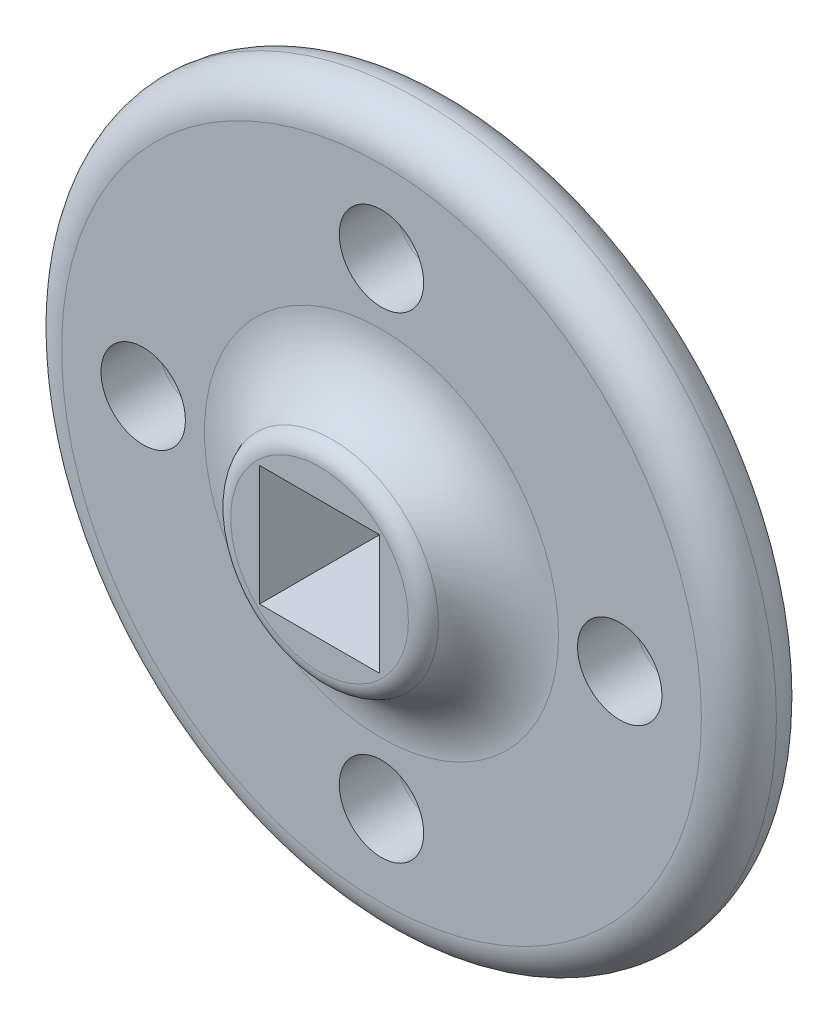
ISO-10303-21;
HEADER;
FILE_DESCRIPTION(('STEP AP214'),'2;1');
FILE_NAME('part.step','',(''),(''),'','','');
FILE_SCHEMA(('AUTOMOTIVE_DESIGN { 1 0 10303 214 1 1 1 1 }'));
ENDSEC;
DATA;
#1=APPLICATION_CONTEXT('core data for automotive mechanical design processes');
#2=APPLICATION_PROTOCOL_DEFINITION('international standard','automotive_design',2000,#1);
#3=PRODUCT_CONTEXT('',#1,'mechanical');
#4=PRODUCT('Part','Part','',(#3));
#5=PRODUCT_RELATED_PRODUCT_CATEGORY('part','',(#4));
#6=PRODUCT_DEFINITION_FORMATION('','',#4);
#7=PRODUCT_DEFINITION_CONTEXT('part definition',#1,'design');
#8=PRODUCT_DEFINITION('design','',#6,#7);
#9=PRODUCT_DEFINITION_SHAPE('','',#8);
#10=(LENGTH_UNIT() NAMED_UNIT(*) SI_UNIT(.MILLI.,.METRE.));
#11=(NAMED_UNIT(*) PLANE_ANGLE_UNIT() SI_UNIT($,.RADIAN.));
#12=(NAMED_UNIT(*) SI_UNIT($,.STERADIAN.) SOLID_ANGLE_UNIT());
#13=UNCERTAINTY_MEASURE_WITH_UNIT(LENGTH_MEASURE(1.E-05),#10,'distance_accuracy_value','');
#14=(GEOMETRIC_REPRESENTATION_CONTEXT(3) GLOBAL_UNCERTAINTY_ASSIGNED_CONTEXT((#13)) GLOBAL_UNIT_ASSIGNED_CONTEXT((#10,
#11,#12)) REPRESENTATION_CONTEXT('',''));
#15=CARTESIAN_POINT('',(0.,0.,0.));
#16=DIRECTION('',(0.,0.,1.));
#17=DIRECTION('',(1.,0.,0.));
#18=AXIS2_PLACEMENT_3D('',#15,#16,#17);
#19=CARTESIAN_POINT('',(0.,0.,4.));
#20=DIRECTION('',(0.,0.,1.));
#21=DIRECTION('',(1.,0.,0.));
#22=AXIS2_PLACEMENT_3D('',#19,#20,#21);
#23=PLANE('',#22);
#24=CARTESIAN_POINT('',(0.,0.,4.));
#25=DIRECTION('',(0.,0.,1.));
#26=DIRECTION('',(1.,0.,0.));
#27=AXIS2_PLACEMENT_3D('',#24,#25,#26);
#28=CIRCLE('',#27,17.05);
#29=CARTESIAN_POINT('',(17.05,0.,4.));
#30=VERTEX_POINT('',#29);
#31=EDGE_CURVE('E165',#30,#30,#28,.T.);
#32=ORIENTED_EDGE('',*,*,#31,.T.);
#33=EDGE_LOOP('',(#32));
#34=FACE_BOUND('',#33,.T.);
#35=CARTESIAN_POINT('',(0.,0.,4.));
#36=DIRECTION('',(0.,0.,1.));
#37=DIRECTION('',(1.,0.,0.));
#38=AXIS2_PLACEMENT_3D('',#35,#36,#37);
#39=CIRCLE('',#38,9.43827373350304);
#40=CARTESIAN_POINT('',(9.43827373350304,0.,4.));
#41=VERTEX_POINT('',#40);
#42=EDGE_CURVE('E153',#41,#41,#39,.F.);
#43=ORIENTED_EDGE('',*,*,#42,.T.);
#44=EDGE_LOOP('',(#43));
#45=FACE_BOUND('',#44,.T.);
#46=CARTESIAN_POINT('',(0.,12.7,4.));
#47=DIRECTION('',(0.,0.,1.));
#48=DIRECTION('',(1.,0.,0.));
#49=AXIS2_PLACEMENT_3D('',#46,#47,#48);
#50=CIRCLE('',#49,2.25);
#51=CARTESIAN_POINT('',(2.25,12.7,4.));
#52=VERTEX_POINT('',#51);
#53=EDGE_CURVE('E146',#52,#52,#50,.T.);
#54=ORIENTED_EDGE('',*,*,#53,.F.);
#55=EDGE_LOOP('',(#54));
#56=FACE_BOUND('',#55,.T.);
#57=CARTESIAN_POINT('',(-12.7,0.,4.));
#58=DIRECTION('',(0.,0.,1.));
#59=DIRECTION('',(1.,0.,0.));
#60=AXIS2_PLACEMENT_3D('',#57,#58,#59);
#61=CIRCLE('',#60,2.25);
#62=CARTESIAN_POINT('',(-10.45,0.,4.));
#63=VERTEX_POINT('',#62);
#64=EDGE_CURVE('E143',#63,#63,#61,.T.);
#65=ORIENTED_EDGE('',*,*,#64,.F.);
#66=EDGE_LOOP('',(#65));
#67=FACE_BOUND('',#66,.T.);
#68=CARTESIAN_POINT('',(0.,-12.7,4.));
#69=DIRECTION('',(0.,0.,1.));
#70=DIRECTION('',(1.,0.,0.));
#71=AXIS2_PLACEMENT_3D('',#68,#69,#70);
#72=CIRCLE('',#71,2.25);
#73=CARTESIAN_POINT('',(2.25,-12.7,4.));
#74=VERTEX_POINT('',#73);
#75=EDGE_CURVE('E140',#74,#74,#72,.T.);
#76=ORIENTED_EDGE('',*,*,#75,.F.);
#77=EDGE_LOOP('',(#76));
#78=FACE_BOUND('',#77,.T.);
#79=CARTESIAN_POINT('',(12.7,0.,4.));
#80=DIRECTION('',(0.,0.,1.));
#81=DIRECTION('',(1.,0.,0.));
#82=AXIS2_PLACEMENT_3D('',#79,#80,#81);
#83=CIRCLE('',#82,2.25);
#84=CARTESIAN_POINT('',(14.95,0.,4.));
#85=VERTEX_POINT('',#84);
#86=EDGE_CURVE('E137',#85,#85,#83,.T.);
#87=ORIENTED_EDGE('',*,*,#86,.F.);
#88=EDGE_LOOP('',(#87));
#89=FACE_BOUND('',#88,.T.);
#90=ADVANCED_FACE('F53',(#34,#45,#56,#67,#78,#89),#23,.T.);
#91=CARTESIAN_POINT('',(-3.2,0.,4.));
#92=DIRECTION('',(1.,0.,0.));
#93=DIRECTION('',(0.,1.,0.));
#94=AXIS2_PLACEMENT_3D('',#91,#92,#93);
#95=PLANE('',#94);
#96=DIRECTION('',(0.,0.,-1.));
#97=VECTOR('',#96,1.);
#98=CARTESIAN_POINT('',(-3.2,-3.2,4.));
#99=LINE('',#98,#97);
#100=CARTESIAN_POINT('',(-3.2,-3.2,7.3));
#101=VERTEX_POINT('',#100);
#102=CARTESIAN_POINT('',(-3.2,-3.2,1.));
#103=VERTEX_POINT('',#102);
#104=EDGE_CURVE('E119',#101,#103,#99,.T.);
#105=ORIENTED_EDGE('',*,*,#104,.T.);
#106=DIRECTION('',(0.,-1.,0.));
#107=VECTOR('',#106,1.);
#108=CARTESIAN_POINT('',(-3.2,3.2,1.));
#109=LINE('',#108,#107);
#110=CARTESIAN_POINT('',(-3.2,3.2,1.));
#111=VERTEX_POINT('',#110);
#112=EDGE_CURVE('E77',#103,#111,#109,.F.);
#113=ORIENTED_EDGE('',*,*,#112,.T.);
#114=DIRECTION('',(0.,0.,-1.));
#115=VECTOR('',#114,1.);
#116=CARTESIAN_POINT('',(-3.2,3.2,4.));
#117=LINE('',#116,#115);
#118=CARTESIAN_POINT('',(-3.2,3.2,7.3));
#119=VERTEX_POINT('',#118);
#120=EDGE_CURVE('E151',#119,#111,#117,.T.);
#121=ORIENTED_EDGE('',*,*,#120,.F.);
#122=DIRECTION('',(0.,1.,0.));
#123=VECTOR('',#122,1.);
#124=CARTESIAN_POINT('',(-3.2,0.,7.3));
#125=LINE('',#124,#123);
#126=EDGE_CURVE('E133',#101,#119,#125,.T.);
#127=ORIENTED_EDGE('',*,*,#126,.F.);
#128=EDGE_LOOP('',(#105,#113,#121,#127));
#129=FACE_BOUND('',#128,.T.);
#130=ADVANCED_FACE('F240',(#129),#95,.T.);
#131=CARTESIAN_POINT('',(0.,3.2,4.));
#132=DIRECTION('',(0.,-1.,0.));
#133=DIRECTION('',(1.,0.,0.));
#134=AXIS2_PLACEMENT_3D('',#131,#132,#133);
#135=PLANE('',#134);
#136=ORIENTED_EDGE('',*,*,#120,.T.);
#137=DIRECTION('',(-1.,0.,0.));
#138=VECTOR('',#137,1.);
#139=CARTESIAN_POINT('',(3.2,3.2,1.));
#140=LINE('',#139,#138);
#141=CARTESIAN_POINT('',(3.2,3.2,1.));
#142=VERTEX_POINT('',#141);
#143=EDGE_CURVE('E198',#111,#142,#140,.F.);
#144=ORIENTED_EDGE('',*,*,#143,.T.);
#145=DIRECTION('',(0.,0.,-1.));
#146=VECTOR('',#145,1.);
#147=CARTESIAN_POINT('',(3.2,3.2,4.));
#148=LINE('',#147,#146);
#149=CARTESIAN_POINT('',(3.2,3.2,7.3));
#150=VERTEX_POINT('',#149);
#151=EDGE_CURVE('E118',#150,#142,#148,.T.);
#152=ORIENTED_EDGE('',*,*,#151,.F.);
#153=DIRECTION('',(1.,0.,0.));
#154=VECTOR('',#153,1.);
#155=CARTESIAN_POINT('',(0.,3.2,7.3));
#156=LINE('',#155,#154);
#157=EDGE_CURVE('E131',#119,#150,#156,.T.);
#158=ORIENTED_EDGE('',*,*,#157,.F.);
#159=EDGE_LOOP('',(#136,#144,#152,#158));
#160=FACE_BOUND('',#159,.T.);
#161=ADVANCED_FACE('F246',(#160),#135,.T.);
#162=CARTESIAN_POINT('',(3.2,0.,4.));
#163=DIRECTION('',(1.,0.,0.));
#164=DIRECTION('',(0.,1.,0.));
#165=AXIS2_PLACEMENT_3D('',#162,#163,#164);
#166=PLANE('',#165);
#167=ORIENTED_EDGE('',*,*,#151,.T.);
#168=DIRECTION('',(0.,-1.,0.));
#169=VECTOR('',#168,1.);
#170=CARTESIAN_POINT('',(3.2,0.,1.));
#171=LINE('',#170,#169);
#172=CARTESIAN_POINT('',(3.2,-3.2,1.));
#173=VERTEX_POINT('',#172);
#174=EDGE_CURVE('E117',#142,#173,#171,.T.);
#175=ORIENTED_EDGE('',*,*,#174,.T.);
#176=DIRECTION('',(0.,0.,-1.));
#177=VECTOR('',#176,1.);
#178=CARTESIAN_POINT('',(3.2,-3.2,4.));
#179=LINE('',#178,#177);
#180=CARTESIAN_POINT('',(3.2,-3.2,7.3));
#181=VERTEX_POINT('',#180);
#182=EDGE_CURVE('E109',#181,#173,#179,.T.);
#183=ORIENTED_EDGE('',*,*,#182,.F.);
#184=DIRECTION('',(0.,1.,0.));
#185=VECTOR('',#184,1.);
#186=CARTESIAN_POINT('',(3.2,0.,7.3));
#187=LINE('',#186,#185);
#188=EDGE_CURVE('E114',#181,#150,#187,.T.);
#189=ORIENTED_EDGE('',*,*,#188,.T.);
#190=EDGE_LOOP('',(#167,#175,#183,#189));
#191=FACE_BOUND('',#190,.T.);
#192=ADVANCED_FACE('F112',(#191),#166,.F.);
#193=CARTESIAN_POINT('',(0.,12.7,4.));
#194=DIRECTION('',(0.,0.,-1.));
#195=DIRECTION('',(-1.,0.,0.));
#196=AXIS2_PLACEMENT_3D('',#193,#194,#195);
#197=CYLINDRICAL_SURFACE('',#196,2.25);
#198=CARTESIAN_POINT('',(0.,12.7,1.));
#199=DIRECTION('',(0.,0.,1.));
#200=DIRECTION('',(1.,0.,0.));
#201=AXIS2_PLACEMENT_3D('',#198,#199,#200);
#202=CIRCLE('',#201,2.25);
#203=CARTESIAN_POINT('',(2.25,12.7,1.));
#204=VERTEX_POINT('',#203);
#205=EDGE_CURVE('E12',#204,#204,#202,.F.);
#206=ORIENTED_EDGE('',*,*,#205,.T.);
#207=EDGE_LOOP('',(#206));
#208=FACE_BOUND('',#207,.T.);
#209=ORIENTED_EDGE('',*,*,#53,.T.);
#210=EDGE_LOOP('',(#209));
#211=FACE_BOUND('',#210,.T.);
#212=ADVANCED_FACE('F259',(#208,#211),#197,.F.);
#213=CARTESIAN_POINT('',(-12.7,0.,4.));
#214=DIRECTION('',(0.,0.,-1.));
#215=DIRECTION('',(-1.,0.,0.));
#216=AXIS2_PLACEMENT_3D('',#213,#214,#215);
#217=CYLINDRICAL_SURFACE('',#216,2.25);
#218=CARTESIAN_POINT('',(-12.7,0.,1.));
#219=DIRECTION('',(0.,0.,1.));
#220=DIRECTION('',(1.,0.,0.));
#221=AXIS2_PLACEMENT_3D('',#218,#219,#220);
#222=CIRCLE('',#221,2.25);
#223=CARTESIAN_POINT('',(-10.45,0.,1.));
#224=VERTEX_POINT('',#223);
#225=EDGE_CURVE('E194',#224,#224,#222,.F.);
#226=ORIENTED_EDGE('',*,*,#225,.T.);
#227=EDGE_LOOP('',(#226));
#228=FACE_BOUND('',#227,.T.);
#229=ORIENTED_EDGE('',*,*,#64,.T.);
#230=EDGE_LOOP('',(#229));
#231=FACE_BOUND('',#230,.T.);
#232=ADVANCED_FACE('F265',(#228,#231),#217,.F.);
#233=CARTESIAN_POINT('',(0.,-12.7,4.));
#234=DIRECTION('',(0.,0.,-1.));
#235=DIRECTION('',(-1.,0.,0.));
#236=AXIS2_PLACEMENT_3D('',#233,#234,#235);
#237=CYLINDRICAL_SURFACE('',#236,2.25);
#238=CARTESIAN_POINT('',(0.,-12.7,1.));
#239=DIRECTION('',(0.,0.,1.));
#240=DIRECTION('',(1.,0.,0.));
#241=AXIS2_PLACEMENT_3D('',#238,#239,#240);
#242=CIRCLE('',#241,2.25);
#243=CARTESIAN_POINT('',(2.25,-12.7,1.));
#244=VERTEX_POINT('',#243);
#245=EDGE_CURVE('E191',#244,#244,#242,.F.);
#246=ORIENTED_EDGE('',*,*,#245,.T.);
#247=EDGE_LOOP('',(#246));
#248=FACE_BOUND('',#247,.T.);
#249=ORIENTED_EDGE('',*,*,#75,.T.);
#250=EDGE_LOOP('',(#249));
#251=FACE_BOUND('',#250,.T.);
#252=ADVANCED_FACE('F269',(#248,#251),#237,.F.);
#253=CARTESIAN_POINT('',(12.7,0.,4.));
#254=DIRECTION('',(0.,0.,-1.));
#255=DIRECTION('',(-1.,0.,0.));
#256=AXIS2_PLACEMENT_3D('',#253,#254,#255);
#257=CYLINDRICAL_SURFACE('',#256,2.25);
#258=CARTESIAN_POINT('',(12.7,0.,1.));
#259=DIRECTION('',(0.,0.,1.));
#260=DIRECTION('',(1.,0.,0.));
#261=AXIS2_PLACEMENT_3D('',#258,#259,#260);
#262=CIRCLE('',#261,2.25);
#263=CARTESIAN_POINT('',(14.95,0.,1.));
#264=VERTEX_POINT('',#263);
#265=EDGE_CURVE('E62',#264,#264,#262,.F.);
#266=ORIENTED_EDGE('',*,*,#265,.T.);
#267=EDGE_LOOP('',(#266));
#268=FACE_BOUND('',#267,.T.);
#269=ORIENTED_EDGE('',*,*,#86,.T.);
#270=EDGE_LOOP('',(#269));
#271=FACE_BOUND('',#270,.T.);
#272=ADVANCED_FACE('F256',(#268,#271),#257,.F.);
#273=CARTESIAN_POINT('',(0.,-3.2,4.));
#274=DIRECTION('',(0.,-1.,0.));
#275=DIRECTION('',(1.,0.,0.));
#276=AXIS2_PLACEMENT_3D('',#273,#274,#275);
#277=PLANE('',#276);
#278=ORIENTED_EDGE('',*,*,#182,.T.);
#279=DIRECTION('',(-1.,0.,0.));
#280=VECTOR('',#279,1.);
#281=CARTESIAN_POINT('',(0.,-3.2,1.));
#282=LINE('',#281,#280);
#283=EDGE_CURVE('E70',#173,#103,#282,.T.);
#284=ORIENTED_EDGE('',*,*,#283,.T.);
#285=ORIENTED_EDGE('',*,*,#104,.F.);
#286=DIRECTION('',(1.,0.,0.));
#287=VECTOR('',#286,1.);
#288=CARTESIAN_POINT('',(0.,-3.2,7.3));
#289=LINE('',#288,#287);
#290=EDGE_CURVE('E122',#101,#181,#289,.T.);
#291=ORIENTED_EDGE('',*,*,#290,.T.);
#292=EDGE_LOOP('',(#278,#284,#285,#291));
#293=FACE_BOUND('',#292,.T.);
#294=ADVANCED_FACE('F123',(#293),#277,.F.);
#295=CARTESIAN_POINT('',(0.,0.,0.));
#296=DIRECTION('',(0.,0.,1.));
#297=DIRECTION('',(1.,0.,0.));
#298=AXIS2_PLACEMENT_3D('',#295,#296,#297);
#299=PLANE('',#298);
#300=CARTESIAN_POINT('',(0.,-12.7,0.));
#301=DIRECTION('',(0.,0.,1.));
#302=DIRECTION('',(1.,0.,0.));
#303=AXIS2_PLACEMENT_3D('',#300,#301,#302);
#304=CIRCLE('',#303,3.25);
#305=CARTESIAN_POINT('',(3.25,-12.7,0.));
#306=VERTEX_POINT('',#305);
#307=EDGE_CURVE('E188',#306,#306,#304,.T.);
#308=ORIENTED_EDGE('',*,*,#307,.T.);
#309=EDGE_LOOP('',(#308));
#310=FACE_BOUND('',#309,.T.);
#311=CARTESIAN_POINT('',(-12.7,0.,0.));
#312=DIRECTION('',(0.,0.,1.));
#313=DIRECTION('',(1.,0.,0.));
#314=AXIS2_PLACEMENT_3D('',#311,#312,#313);
#315=CIRCLE('',#314,3.25);
#316=CARTESIAN_POINT('',(-9.45,0.,0.));
#317=VERTEX_POINT('',#316);
#318=EDGE_CURVE('E185',#317,#317,#315,.T.);
#319=ORIENTED_EDGE('',*,*,#318,.T.);
#320=EDGE_LOOP('',(#319));
#321=FACE_BOUND('',#320,.T.);
#322=DIRECTION('',(-1.,0.,0.));
#323=VECTOR('',#322,1.);
#324=CARTESIAN_POINT('',(0.,-4.2,0.));
#325=LINE('',#324,#323);
#326=CARTESIAN_POINT('',(-4.2,-4.2,0.));
#327=VERTEX_POINT('',#326);
#328=CARTESIAN_POINT('',(4.2,-4.2,0.));
#329=VERTEX_POINT('',#328);
#330=EDGE_CURVE('E176',#327,#329,#325,.F.);
#331=ORIENTED_EDGE('',*,*,#330,.T.);
#332=DIRECTION('',(0.,-1.,0.));
#333=VECTOR('',#332,1.);
#334=CARTESIAN_POINT('',(4.2,0.,0.));
#335=LINE('',#334,#333);
#336=CARTESIAN_POINT('',(4.2,4.2,0.));
#337=VERTEX_POINT('',#336);
#338=EDGE_CURVE('E182',#329,#337,#335,.F.);
#339=ORIENTED_EDGE('',*,*,#338,.T.);
#340=DIRECTION('',(-1.,0.,0.));
#341=VECTOR('',#340,1.);
#342=CARTESIAN_POINT('',(-3.2,4.2,0.));
#343=LINE('',#342,#341);
#344=CARTESIAN_POINT('',(-4.2,4.2,0.));
#345=VERTEX_POINT('',#344);
#346=EDGE_CURVE('E180',#337,#345,#343,.T.);
#347=ORIENTED_EDGE('',*,*,#346,.T.);
#348=DIRECTION('',(0.,-1.,0.));
#349=VECTOR('',#348,1.);
#350=CARTESIAN_POINT('',(-4.2,-3.2,0.));
#351=LINE('',#350,#349);
#352=EDGE_CURVE('E178',#345,#327,#351,.T.);
#353=ORIENTED_EDGE('',*,*,#352,.T.);
#354=EDGE_LOOP('',(#331,#339,#347,#353));
#355=FACE_BOUND('',#354,.T.);
#356=CARTESIAN_POINT('',(12.7,0.,0.));
#357=DIRECTION('',(0.,0.,1.));
#358=DIRECTION('',(1.,0.,0.));
#359=AXIS2_PLACEMENT_3D('',#356,#357,#358);
#360=CIRCLE('',#359,3.25);
#361=CARTESIAN_POINT('',(15.95,0.,0.));
#362=VERTEX_POINT('',#361);
#363=EDGE_CURVE('E173',#362,#362,#360,.T.);
#364=ORIENTED_EDGE('',*,*,#363,.T.);
#365=EDGE_LOOP('',(#364));
#366=FACE_BOUND('',#365,.T.);
#367=CARTESIAN_POINT('',(0.,12.7,0.));
#368=DIRECTION('',(0.,0.,1.));
#369=DIRECTION('',(1.,0.,0.));
#370=AXIS2_PLACEMENT_3D('',#367,#368,#369);
#371=CIRCLE('',#370,3.25);
#372=CARTESIAN_POINT('',(3.25,12.7,0.));
#373=VERTEX_POINT('',#372);
#374=EDGE_CURVE('E168',#373,#373,#371,.T.);
#375=ORIENTED_EDGE('',*,*,#374,.T.);
#376=EDGE_LOOP('',(#375));
#377=FACE_BOUND('',#376,.T.);
#378=CARTESIAN_POINT('',(0.,0.,0.));
#379=DIRECTION('',(0.,0.,1.));
#380=DIRECTION('',(1.,0.,0.));
#381=AXIS2_PLACEMENT_3D('',#378,#379,#380);
#382=CIRCLE('',#381,17.05);
#383=CARTESIAN_POINT('',(17.05,0.,0.));
#384=VERTEX_POINT('',#383);
#385=EDGE_CURVE('E162',#384,#384,#382,.F.);
#386=ORIENTED_EDGE('',*,*,#385,.T.);
#387=EDGE_LOOP('',(#386));
#388=FACE_BOUND('',#387,.T.);
#389=ADVANCED_FACE('F223',(#310,#321,#355,#366,#377,#388),#299,.F.);
#390=CARTESIAN_POINT('',(0.,0.,7.3));
#391=DIRECTION('',(0.,0.,1.));
#392=DIRECTION('',(1.,0.,0.));
#393=AXIS2_PLACEMENT_3D('',#390,#391,#392);
#394=PLANE('',#393);
#395=CARTESIAN_POINT('',(0.,0.,7.3));
#396=DIRECTION('',(0.,0.,1.));
#397=DIRECTION('',(1.,0.,0.));
#398=AXIS2_PLACEMENT_3D('',#395,#396,#397);
#399=CIRCLE('',#398,4.73614655529954);
#400=CARTESIAN_POINT('',(4.73614655529954,0.,7.3));
#401=VERTEX_POINT('',#400);
#402=EDGE_CURVE('E156',#401,#401,#399,.T.);
#403=ORIENTED_EDGE('',*,*,#402,.T.);
#404=EDGE_LOOP('',(#403));
#405=FACE_BOUND('',#404,.T.);
#406=ORIENTED_EDGE('',*,*,#188,.F.);
#407=ORIENTED_EDGE('',*,*,#290,.F.);
#408=ORIENTED_EDGE('',*,*,#126,.T.);
#409=ORIENTED_EDGE('',*,*,#157,.T.);
#410=EDGE_LOOP('',(#406,#407,#408,#409));
#411=FACE_BOUND('',#410,.T.);
#412=ADVANCED_FACE('F129',(#405,#411),#394,.T.);
#413=CARTESIAN_POINT('',(0.,0.,8.));
#414=DIRECTION('',(0.,0.,1.));
#415=DIRECTION('',(1.,0.,0.));
#416=AXIS2_PLACEMENT_3D('',#413,#414,#415);
#417=TOROIDAL_SURFACE('',#416,9.43827373350304,4.);
#418=CARTESIAN_POINT('',(0.,0.,6.64));
#419=DIRECTION('',(0.,0.,1.));
#420=DIRECTION('',(1.,0.,0.));
#421=AXIS2_PLACEMENT_3D('',#418,#419,#420);
#422=CIRCLE('',#421,5.67657199094024);
#423=CARTESIAN_POINT('',(5.67657199094024,0.,6.64));
#424=VERTEX_POINT('',#423);
#425=EDGE_CURVE('E159',#424,#424,#422,.F.);
#426=ORIENTED_EDGE('',*,*,#425,.T.);
#427=EDGE_LOOP('',(#426));
#428=FACE_BOUND('',#427,.T.);
#429=ORIENTED_EDGE('',*,*,#42,.F.);
#430=EDGE_LOOP('',(#429));
#431=FACE_BOUND('',#430,.T.);
#432=ADVANCED_FACE('F277',(#428,#431),#417,.F.);
#433=CARTESIAN_POINT('',(0.,0.,6.3));
#434=DIRECTION('',(0.,0.,-1.));
#435=DIRECTION('',(-1.,0.,0.));
#436=AXIS2_PLACEMENT_3D('',#433,#434,#435);
#437=TOROIDAL_SURFACE('',#436,4.73614655529954,1.);
#438=ORIENTED_EDGE('',*,*,#425,.F.);
#439=EDGE_LOOP('',(#438));
#440=FACE_BOUND('',#439,.T.);
#441=ORIENTED_EDGE('',*,*,#402,.F.);
#442=EDGE_LOOP('',(#441));
#443=FACE_BOUND('',#442,.T.);
#444=ADVANCED_FACE('F280',(#440,#443),#437,.T.);
#445=CARTESIAN_POINT('',(0.,0.,2.));
#446=DIRECTION('',(0.,0.,1.));
#447=DIRECTION('',(1.,0.,0.));
#448=AXIS2_PLACEMENT_3D('',#445,#446,#447);
#449=TOROIDAL_SURFACE('',#448,17.05,2.);
#450=ORIENTED_EDGE('',*,*,#31,.F.);
#451=EDGE_LOOP('',(#450));
#452=FACE_BOUND('',#451,.T.);
#453=CARTESIAN_POINT('',(0.,0.,2.));
#454=DIRECTION('',(0.,0.,1.));
#455=DIRECTION('',(1.,0.,0.));
#456=AXIS2_PLACEMENT_3D('',#453,#454,#455);
#457=CIRCLE('',#456,19.05);
#458=CARTESIAN_POINT('',(19.05,0.,2.));
#459=VERTEX_POINT('',#458);
#460=EDGE_CURVE('E127',#459,#459,#457,.F.);
#461=ORIENTED_EDGE('',*,*,#460,.F.);
#462=EDGE_LOOP('',(#461));
#463=FACE_BOUND('',#462,.T.);
#464=ADVANCED_FACE('F284',(#452,#463),#449,.T.);
#465=CARTESIAN_POINT('',(0.,0.,2.));
#466=DIRECTION('',(0.,0.,1.));
#467=DIRECTION('',(1.,0.,0.));
#468=AXIS2_PLACEMENT_3D('',#465,#466,#467);
#469=TOROIDAL_SURFACE('',#468,17.05,2.);
#470=ORIENTED_EDGE('',*,*,#385,.F.);
#471=EDGE_LOOP('',(#470));
#472=FACE_BOUND('',#471,.T.);
#473=ORIENTED_EDGE('',*,*,#460,.T.);
#474=EDGE_LOOP('',(#473));
#475=FACE_BOUND('',#474,.T.);
#476=ADVANCED_FACE('F286',(#472,#475),#469,.T.);
#477=CARTESIAN_POINT('',(0.,-12.7,1.));
#478=DIRECTION('',(0.,0.,1.));
#479=DIRECTION('',(1.,0.,0.));
#480=AXIS2_PLACEMENT_3D('',#477,#478,#479);
#481=TOROIDAL_SURFACE('',#480,3.25,1.);
#482=ORIENTED_EDGE('',*,*,#245,.F.);
#483=EDGE_LOOP('',(#482));
#484=FACE_BOUND('',#483,.T.);
#485=ORIENTED_EDGE('',*,*,#307,.F.);
#486=EDGE_LOOP('',(#485));
#487=FACE_BOUND('',#486,.T.);
#488=ADVANCED_FACE('F289',(#484,#487),#481,.T.);
#489=CARTESIAN_POINT('',(-12.7,0.,1.));
#490=DIRECTION('',(0.,0.,1.));
#491=DIRECTION('',(1.,0.,0.));
#492=AXIS2_PLACEMENT_3D('',#489,#490,#491);
#493=TOROIDAL_SURFACE('',#492,3.25,1.);
#494=ORIENTED_EDGE('',*,*,#225,.F.);
#495=EDGE_LOOP('',(#494));
#496=FACE_BOUND('',#495,.T.);
#497=ORIENTED_EDGE('',*,*,#318,.F.);
#498=EDGE_LOOP('',(#497));
#499=FACE_BOUND('',#498,.T.);
#500=ADVANCED_FACE('F296',(#496,#499),#493,.T.);
#501=CARTESIAN_POINT('',(-4.2,0.,1.));
#502=DIRECTION('',(0.,1.,0.));
#503=DIRECTION('',(-1.,0.,0.));
#504=AXIS2_PLACEMENT_3D('',#501,#502,#503);
#505=CYLINDRICAL_SURFACE('',#504,1.);
#506=CARTESIAN_POINT('',(-4.2,-4.2,1.));
#507=DIRECTION('',(-0.707106781186548,0.707106781186547,0.));
#508=DIRECTION('',(0.707106781186547,0.707106781186548,0.));
#509=AXIS2_PLACEMENT_3D('',#506,#507,#508);
#510=ELLIPSE('',#509,1.41421356237309,1.);
#511=EDGE_CURVE('E207',#327,#103,#510,.F.);
#512=ORIENTED_EDGE('',*,*,#511,.F.);
#513=ORIENTED_EDGE('',*,*,#352,.F.);
#514=CARTESIAN_POINT('',(-4.2,4.2,1.));
#515=DIRECTION('',(0.707106781186547,0.707106781186548,0.));
#516=DIRECTION('',(0.707106781186548,-0.707106781186547,0.));
#517=AXIS2_PLACEMENT_3D('',#514,#515,#516);
#518=ELLIPSE('',#517,1.41421356237309,1.);
#519=EDGE_CURVE('E57',#111,#345,#518,.T.);
#520=ORIENTED_EDGE('',*,*,#519,.F.);
#521=ORIENTED_EDGE('',*,*,#112,.F.);
#522=EDGE_LOOP('',(#512,#513,#520,#521));
#523=FACE_BOUND('',#522,.T.);
#524=ADVANCED_FACE('F221',(#523),#505,.T.);
#525=CARTESIAN_POINT('',(0.,4.2,1.));
#526=DIRECTION('',(1.,0.,0.));
#527=DIRECTION('',(0.,1.,0.));
#528=AXIS2_PLACEMENT_3D('',#525,#526,#527);
#529=CYLINDRICAL_SURFACE('',#528,1.);
#530=ORIENTED_EDGE('',*,*,#519,.T.);
#531=ORIENTED_EDGE('',*,*,#346,.F.);
#532=CARTESIAN_POINT('',(4.2,4.2,1.));
#533=DIRECTION('',(0.707106781186548,-0.707106781186547,0.));
#534=DIRECTION('',(-0.707106781186547,-0.707106781186548,0.));
#535=AXIS2_PLACEMENT_3D('',#532,#533,#534);
#536=ELLIPSE('',#535,1.41421356237309,1.);
#537=EDGE_CURVE('E206',#142,#337,#536,.T.);
#538=ORIENTED_EDGE('',*,*,#537,.F.);
#539=ORIENTED_EDGE('',*,*,#143,.F.);
#540=EDGE_LOOP('',(#530,#531,#538,#539));
#541=FACE_BOUND('',#540,.T.);
#542=ADVANCED_FACE('F217',(#541),#529,.T.);
#543=CARTESIAN_POINT('',(0.,-4.2,1.));
#544=DIRECTION('',(-1.,0.,0.));
#545=DIRECTION('',(0.,-1.,0.));
#546=AXIS2_PLACEMENT_3D('',#543,#544,#545);
#547=CYLINDRICAL_SURFACE('',#546,1.);
#548=ORIENTED_EDGE('',*,*,#511,.T.);
#549=ORIENTED_EDGE('',*,*,#283,.F.);
#550=CARTESIAN_POINT('',(4.2,-4.2,1.));
#551=DIRECTION('',(-0.707106781186547,-0.707106781186548,0.));
#552=DIRECTION('',(0.707106781186548,-0.707106781186547,0.));
#553=AXIS2_PLACEMENT_3D('',#550,#551,#552);
#554=ELLIPSE('',#553,1.4142135623731,1.);
#555=EDGE_CURVE('E204',#329,#173,#554,.F.);
#556=ORIENTED_EDGE('',*,*,#555,.F.);
#557=ORIENTED_EDGE('',*,*,#330,.F.);
#558=EDGE_LOOP('',(#548,#549,#556,#557));
#559=FACE_BOUND('',#558,.T.);
#560=ADVANCED_FACE('F229',(#559),#547,.T.);
#561=CARTESIAN_POINT('',(4.2,0.,1.));
#562=DIRECTION('',(0.,-1.,0.));
#563=DIRECTION('',(1.,0.,0.));
#564=AXIS2_PLACEMENT_3D('',#561,#562,#563);
#565=CYLINDRICAL_SURFACE('',#564,1.);
#566=ORIENTED_EDGE('',*,*,#537,.T.);
#567=ORIENTED_EDGE('',*,*,#338,.F.);
#568=ORIENTED_EDGE('',*,*,#555,.T.);
#569=ORIENTED_EDGE('',*,*,#174,.F.);
#570=EDGE_LOOP('',(#566,#567,#568,#569));
#571=FACE_BOUND('',#570,.T.);
#572=ADVANCED_FACE('F228',(#571),#565,.T.);
#573=CARTESIAN_POINT('',(12.7,0.,1.));
#574=DIRECTION('',(0.,0.,1.));
#575=DIRECTION('',(1.,0.,0.));
#576=AXIS2_PLACEMENT_3D('',#573,#574,#575);
#577=TOROIDAL_SURFACE('',#576,3.25,1.);
#578=ORIENTED_EDGE('',*,*,#265,.F.);
#579=EDGE_LOOP('',(#578));
#580=FACE_BOUND('',#579,.T.);
#581=ORIENTED_EDGE('',*,*,#363,.F.);
#582=EDGE_LOOP('',(#581));
#583=FACE_BOUND('',#582,.T.);
#584=ADVANCED_FACE('F236',(#580,#583),#577,.T.);
#585=CARTESIAN_POINT('',(0.,12.7,1.));
#586=DIRECTION('',(0.,0.,1.));
#587=DIRECTION('',(1.,0.,0.));
#588=AXIS2_PLACEMENT_3D('',#585,#586,#587);
#589=TOROIDAL_SURFACE('',#588,3.25,1.);
#590=ORIENTED_EDGE('',*,*,#205,.F.);
#591=EDGE_LOOP('',(#590));
#592=FACE_BOUND('',#591,.T.);
#593=ORIENTED_EDGE('',*,*,#374,.F.);
#594=EDGE_LOOP('',(#593));
#595=FACE_BOUND('',#594,.T.);
#596=ADVANCED_FACE('F55',(#592,#595),#589,.T.);
#597=CLOSED_SHELL('',(#90,#130,#161,#192,#212,#232,#252,#272,#294,#389,#412,#432,#444,#464,#476,
#488,#500,#524,#542,#560,#572,#584,#596));
#598=MANIFOLD_SOLID_BREP('B2',#597);
#599=ADVANCED_BREP_SHAPE_REPRESENTATION('',(#18,#598),#14);
#600=SHAPE_DEFINITION_REPRESENTATION(#9,#599);
ENDSEC;
END-ISO-10303-21;
